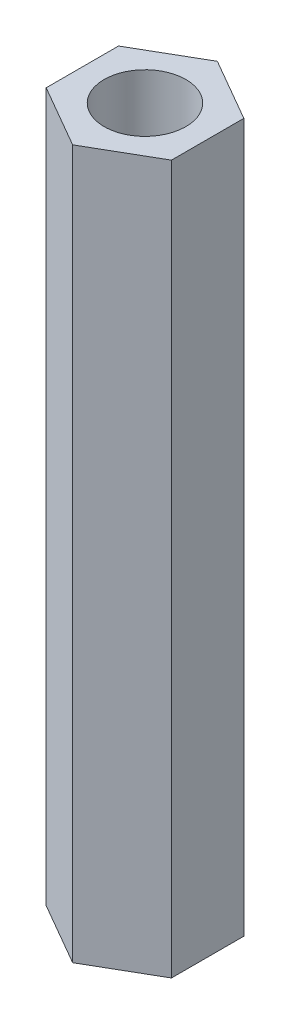
ISO-10303-21;
HEADER;
FILE_DESCRIPTION(('STEP AP214'),'2;1');
FILE_NAME('part.step','',(''),(''),'','','');
FILE_SCHEMA(('AUTOMOTIVE_DESIGN { 1 0 10303 214 1 1 1 1 }'));
ENDSEC;
DATA;
#1=APPLICATION_CONTEXT('core data for automotive mechanical design processes');
#2=APPLICATION_PROTOCOL_DEFINITION('international standard','automotive_design',2000,#1);
#3=PRODUCT_CONTEXT('',#1,'mechanical');
#4=PRODUCT('Part','Part','',(#3));
#5=PRODUCT_RELATED_PRODUCT_CATEGORY('part','',(#4));
#6=PRODUCT_DEFINITION_FORMATION('','',#4);
#7=PRODUCT_DEFINITION_CONTEXT('part definition',#1,'design');
#8=PRODUCT_DEFINITION('design','',#6,#7);
#9=PRODUCT_DEFINITION_SHAPE('','',#8);
#10=(LENGTH_UNIT() NAMED_UNIT(*) SI_UNIT(.MILLI.,.METRE.));
#11=(NAMED_UNIT(*) PLANE_ANGLE_UNIT() SI_UNIT($,.RADIAN.));
#12=(NAMED_UNIT(*) SI_UNIT($,.STERADIAN.) SOLID_ANGLE_UNIT());
#13=UNCERTAINTY_MEASURE_WITH_UNIT(LENGTH_MEASURE(1.E-05),#10,'distance_accuracy_value','');
#14=(GEOMETRIC_REPRESENTATION_CONTEXT(3) GLOBAL_UNCERTAINTY_ASSIGNED_CONTEXT((#13)) GLOBAL_UNIT_ASSIGNED_CONTEXT((#10,
#11,#12)) REPRESENTATION_CONTEXT('',''));
#15=CARTESIAN_POINT('',(0.,0.,0.));
#16=DIRECTION('',(0.,0.,1.));
#17=DIRECTION('',(1.,0.,0.));
#18=AXIS2_PLACEMENT_3D('',#15,#16,#17);
#19=CARTESIAN_POINT('',(0.,26.,0.));
#20=DIRECTION('',(0.,1.,0.));
#21=DIRECTION('',(0.,0.,1.));
#22=AXIS2_PLACEMENT_3D('',#19,#20,#21);
#23=PLANE('',#22);
#24=DIRECTION('',(-0.866025403784442,0.,-0.499999999999995));
#25=VECTOR('',#24,1.);
#26=CARTESIAN_POINT('',(2.29999999999999,26.,-1.32790561913617));
#27=LINE('',#26,#25);
#28=CARTESIAN_POINT('',(2.29999999999999,26.,-1.32790561913617));
#29=VERTEX_POINT('',#28);
#30=CARTESIAN_POINT('',(0.,26.,-2.65581123827228));
#31=VERTEX_POINT('',#30);
#32=EDGE_CURVE('E134',#29,#31,#27,.T.);
#33=ORIENTED_EDGE('',*,*,#32,.T.);
#34=DIRECTION('',(-0.866025403784438,0.,0.500000000000001));
#35=VECTOR('',#34,1.);
#36=CARTESIAN_POINT('',(0.,26.,-2.65581123827228));
#37=LINE('',#36,#35);
#38=CARTESIAN_POINT('',(-2.3,26.,-1.32790561913613));
#39=VERTEX_POINT('',#38);
#40=EDGE_CURVE('E92',#31,#39,#37,.T.);
#41=ORIENTED_EDGE('',*,*,#40,.T.);
#42=DIRECTION('',(0.,0.,1.));
#43=VECTOR('',#42,1.);
#44=CARTESIAN_POINT('',(-2.3,26.,-1.32790561913613));
#45=LINE('',#44,#43);
#46=CARTESIAN_POINT('',(-2.3,26.,1.32790561913615));
#47=VERTEX_POINT('',#46);
#48=EDGE_CURVE('E105',#39,#47,#45,.T.);
#49=ORIENTED_EDGE('',*,*,#48,.T.);
#50=DIRECTION('',(0.866025403784442,0.,0.499999999999995));
#51=VECTOR('',#50,1.);
#52=CARTESIAN_POINT('',(-2.3,26.,1.32790561913615));
#53=LINE('',#52,#51);
#54=CARTESIAN_POINT('',(0.,26.,2.65581123827228));
#55=VERTEX_POINT('',#54);
#56=EDGE_CURVE('E99',#47,#55,#53,.T.);
#57=ORIENTED_EDGE('',*,*,#56,.T.);
#58=DIRECTION('',(0.866025403784435,0.,-0.500000000000007));
#59=VECTOR('',#58,1.);
#60=CARTESIAN_POINT('',(0.,26.,2.65581123827228));
#61=LINE('',#60,#59);
#62=CARTESIAN_POINT('',(2.30000000000001,26.,1.32790561913612));
#63=VERTEX_POINT('',#62);
#64=EDGE_CURVE('E103',#55,#63,#61,.T.);
#65=ORIENTED_EDGE('',*,*,#64,.T.);
#66=DIRECTION('',(0.,0.,-1.));
#67=VECTOR('',#66,1.);
#68=CARTESIAN_POINT('',(2.30000000000001,26.,1.32790561913612));
#69=LINE('',#68,#67);
#70=EDGE_CURVE('E55',#63,#29,#69,.T.);
#71=ORIENTED_EDGE('',*,*,#70,.T.);
#72=EDGE_LOOP('',(#33,#41,#49,#57,#65,#71));
#73=FACE_BOUND('',#72,.T.);
#74=CARTESIAN_POINT('',(0.,26.,0.));
#75=DIRECTION('',(0.,1.,0.));
#76=DIRECTION('',(0.,0.,1.));
#77=AXIS2_PLACEMENT_3D('',#74,#75,#76);
#78=CIRCLE('',#77,1.5);
#79=CARTESIAN_POINT('',(0.,26.,-1.5));
#80=VERTEX_POINT('',#79);
#81=EDGE_CURVE('E127',#80,#80,#78,.T.);
#82=ORIENTED_EDGE('',*,*,#81,.F.);
#83=EDGE_LOOP('',(#82));
#84=FACE_BOUND('',#83,.T.);
#85=ADVANCED_FACE('F38',(#73,#84),#23,.T.);
#86=CARTESIAN_POINT('',(0.,0.,0.));
#87=DIRECTION('',(0.,1.,0.));
#88=DIRECTION('',(0.,0.,1.));
#89=AXIS2_PLACEMENT_3D('',#86,#87,#88);
#90=PLANE('',#89);
#91=DIRECTION('',(-0.866025403784442,0.,-0.499999999999995));
#92=VECTOR('',#91,1.);
#93=CARTESIAN_POINT('',(2.29999999999999,0.,-1.32790561913617));
#94=LINE('',#93,#92);
#95=CARTESIAN_POINT('',(2.29999999999999,0.,-1.32790561913617));
#96=VERTEX_POINT('',#95);
#97=CARTESIAN_POINT('',(0.,0.,-2.65581123827228));
#98=VERTEX_POINT('',#97);
#99=EDGE_CURVE('E123',#96,#98,#94,.T.);
#100=ORIENTED_EDGE('',*,*,#99,.F.);
#101=DIRECTION('',(0.,0.,-1.));
#102=VECTOR('',#101,1.);
#103=CARTESIAN_POINT('',(2.30000000000001,0.,1.32790561913612));
#104=LINE('',#103,#102);
#105=CARTESIAN_POINT('',(2.30000000000001,0.,1.32790561913612));
#106=VERTEX_POINT('',#105);
#107=EDGE_CURVE('E84',#106,#96,#104,.T.);
#108=ORIENTED_EDGE('',*,*,#107,.F.);
#109=DIRECTION('',(0.866025403784435,0.,-0.500000000000007));
#110=VECTOR('',#109,1.);
#111=CARTESIAN_POINT('',(0.,0.,2.65581123827228));
#112=LINE('',#111,#110);
#113=CARTESIAN_POINT('',(0.,0.,2.65581123827228));
#114=VERTEX_POINT('',#113);
#115=EDGE_CURVE('E78',#114,#106,#112,.T.);
#116=ORIENTED_EDGE('',*,*,#115,.F.);
#117=DIRECTION('',(0.866025403784442,0.,0.499999999999995));
#118=VECTOR('',#117,1.);
#119=CARTESIAN_POINT('',(-2.3,0.,1.32790561913615));
#120=LINE('',#119,#118);
#121=CARTESIAN_POINT('',(-2.3,0.,1.32790561913615));
#122=VERTEX_POINT('',#121);
#123=EDGE_CURVE('E113',#122,#114,#120,.T.);
#124=ORIENTED_EDGE('',*,*,#123,.F.);
#125=DIRECTION('',(0.,0.,1.));
#126=VECTOR('',#125,1.);
#127=CARTESIAN_POINT('',(-2.3,0.,-1.32790561913613));
#128=LINE('',#127,#126);
#129=CARTESIAN_POINT('',(-2.3,0.,-1.32790561913613));
#130=VERTEX_POINT('',#129);
#131=EDGE_CURVE('E129',#130,#122,#128,.T.);
#132=ORIENTED_EDGE('',*,*,#131,.F.);
#133=DIRECTION('',(-0.866025403784438,0.,0.500000000000001));
#134=VECTOR('',#133,1.);
#135=CARTESIAN_POINT('',(0.,0.,-2.65581123827228));
#136=LINE('',#135,#134);
#137=EDGE_CURVE('E126',#98,#130,#136,.T.);
#138=ORIENTED_EDGE('',*,*,#137,.F.);
#139=EDGE_LOOP('',(#100,#108,#116,#124,#132,#138));
#140=FACE_BOUND('',#139,.T.);
#141=CARTESIAN_POINT('',(0.,0.,0.));
#142=DIRECTION('',(0.,1.,0.));
#143=DIRECTION('',(0.,0.,1.));
#144=AXIS2_PLACEMENT_3D('',#141,#142,#143);
#145=CIRCLE('',#144,1.5);
#146=CARTESIAN_POINT('',(0.,0.,-1.5));
#147=VERTEX_POINT('',#146);
#148=EDGE_CURVE('E245',#147,#147,#145,.T.);
#149=ORIENTED_EDGE('',*,*,#148,.T.);
#150=EDGE_LOOP('',(#149));
#151=FACE_BOUND('',#150,.T.);
#152=ADVANCED_FACE('F143',(#140,#151),#90,.F.);
#153=CARTESIAN_POINT('',(2.29999999999999,26.,-1.32790561913617));
#154=DIRECTION('',(-0.499999999999995,0.,0.866025403784442));
#155=DIRECTION('',(0.866025403784442,0.,0.499999999999995));
#156=AXIS2_PLACEMENT_3D('',#153,#154,#155);
#157=PLANE('',#156);
#158=ORIENTED_EDGE('',*,*,#99,.T.);
#159=DIRECTION('',(0.,-1.,0.));
#160=VECTOR('',#159,1.);
#161=CARTESIAN_POINT('',(0.,26.,-2.65581123827228));
#162=LINE('',#161,#160);
#163=EDGE_CURVE('E11',#31,#98,#162,.T.);
#164=ORIENTED_EDGE('',*,*,#163,.F.);
#165=ORIENTED_EDGE('',*,*,#32,.F.);
#166=DIRECTION('',(0.,-1.,0.));
#167=VECTOR('',#166,1.);
#168=CARTESIAN_POINT('',(2.29999999999999,26.,-1.32790561913617));
#169=LINE('',#168,#167);
#170=EDGE_CURVE('E119',#29,#96,#169,.T.);
#171=ORIENTED_EDGE('',*,*,#170,.T.);
#172=EDGE_LOOP('',(#158,#164,#165,#171));
#173=FACE_BOUND('',#172,.T.);
#174=ADVANCED_FACE('F40',(#173),#157,.F.);
#175=CARTESIAN_POINT('',(0.,26.,-2.65581123827228));
#176=DIRECTION('',(0.500000000000001,0.,0.866025403784438));
#177=DIRECTION('',(0.866025403784438,0.,-0.500000000000001));
#178=AXIS2_PLACEMENT_3D('',#175,#176,#177);
#179=PLANE('',#178);
#180=ORIENTED_EDGE('',*,*,#137,.T.);
#181=DIRECTION('',(0.,-1.,0.));
#182=VECTOR('',#181,1.);
#183=CARTESIAN_POINT('',(-2.3,26.,-1.32790561913613));
#184=LINE('',#183,#182);
#185=EDGE_CURVE('E47',#39,#130,#184,.T.);
#186=ORIENTED_EDGE('',*,*,#185,.F.);
#187=ORIENTED_EDGE('',*,*,#40,.F.);
#188=ORIENTED_EDGE('',*,*,#163,.T.);
#189=EDGE_LOOP('',(#180,#186,#187,#188));
#190=FACE_BOUND('',#189,.T.);
#191=ADVANCED_FACE('F168',(#190),#179,.F.);
#192=CARTESIAN_POINT('',(-2.3,26.,-1.32790561913613));
#193=DIRECTION('',(1.,0.,0.));
#194=DIRECTION('',(0.,0.,-1.));
#195=AXIS2_PLACEMENT_3D('',#192,#193,#194);
#196=PLANE('',#195);
#197=ORIENTED_EDGE('',*,*,#131,.T.);
#198=DIRECTION('',(0.,-1.,0.));
#199=VECTOR('',#198,1.);
#200=CARTESIAN_POINT('',(-2.3,26.,1.32790561913615));
#201=LINE('',#200,#199);
#202=EDGE_CURVE('E114',#47,#122,#201,.T.);
#203=ORIENTED_EDGE('',*,*,#202,.F.);
#204=ORIENTED_EDGE('',*,*,#48,.F.);
#205=ORIENTED_EDGE('',*,*,#185,.T.);
#206=EDGE_LOOP('',(#197,#203,#204,#205));
#207=FACE_BOUND('',#206,.T.);
#208=ADVANCED_FACE('F140',(#207),#196,.F.);
#209=CARTESIAN_POINT('',(-2.3,26.,1.32790561913615));
#210=DIRECTION('',(0.499999999999995,0.,-0.866025403784442));
#211=DIRECTION('',(-0.866025403784442,0.,-0.499999999999995));
#212=AXIS2_PLACEMENT_3D('',#209,#210,#211);
#213=PLANE('',#212);
#214=ORIENTED_EDGE('',*,*,#123,.T.);
#215=DIRECTION('',(0.,-1.,0.));
#216=VECTOR('',#215,1.);
#217=CARTESIAN_POINT('',(0.,26.,2.65581123827228));
#218=LINE('',#217,#216);
#219=EDGE_CURVE('E110',#55,#114,#218,.T.);
#220=ORIENTED_EDGE('',*,*,#219,.F.);
#221=ORIENTED_EDGE('',*,*,#56,.F.);
#222=ORIENTED_EDGE('',*,*,#202,.T.);
#223=EDGE_LOOP('',(#214,#220,#221,#222));
#224=FACE_BOUND('',#223,.T.);
#225=ADVANCED_FACE('F111',(#224),#213,.F.);
#226=CARTESIAN_POINT('',(0.,26.,2.65581123827228));
#227=DIRECTION('',(-0.500000000000007,0.,-0.866025403784434));
#228=DIRECTION('',(-0.866025403784435,0.,0.500000000000007));
#229=AXIS2_PLACEMENT_3D('',#226,#227,#228);
#230=PLANE('',#229);
#231=ORIENTED_EDGE('',*,*,#115,.T.);
#232=DIRECTION('',(0.,-1.,0.));
#233=VECTOR('',#232,1.);
#234=CARTESIAN_POINT('',(2.30000000000001,26.,1.32790561913612));
#235=LINE('',#234,#233);
#236=EDGE_CURVE('E115',#63,#106,#235,.T.);
#237=ORIENTED_EDGE('',*,*,#236,.F.);
#238=ORIENTED_EDGE('',*,*,#64,.F.);
#239=ORIENTED_EDGE('',*,*,#219,.T.);
#240=EDGE_LOOP('',(#231,#237,#238,#239));
#241=FACE_BOUND('',#240,.T.);
#242=ADVANCED_FACE('F117',(#241),#230,.F.);
#243=CARTESIAN_POINT('',(2.30000000000001,26.,1.32790561913612));
#244=DIRECTION('',(-1.,0.,0.));
#245=DIRECTION('',(0.,0.,1.));
#246=AXIS2_PLACEMENT_3D('',#243,#244,#245);
#247=PLANE('',#246);
#248=ORIENTED_EDGE('',*,*,#107,.T.);
#249=ORIENTED_EDGE('',*,*,#170,.F.);
#250=ORIENTED_EDGE('',*,*,#70,.F.);
#251=ORIENTED_EDGE('',*,*,#236,.T.);
#252=EDGE_LOOP('',(#248,#249,#250,#251));
#253=FACE_BOUND('',#252,.T.);
#254=ADVANCED_FACE('F148',(#253),#247,.F.);
#255=CARTESIAN_POINT('',(0.,26.,0.));
#256=DIRECTION('',(0.,-1.,0.));
#257=DIRECTION('',(0.,0.,-1.));
#258=AXIS2_PLACEMENT_3D('',#255,#256,#257);
#259=CYLINDRICAL_SURFACE('',#258,1.5);
#260=CARTESIAN_POINT('',(0.,26.,-1.5));
#261=CARTESIAN_POINT('',(0.,25.7291666666667,-1.5));
#262=CARTESIAN_POINT('',(0.,25.4583333333333,-1.5));
#263=CARTESIAN_POINT('',(0.,24.9166666666667,-1.5));
#264=CARTESIAN_POINT('',(0.,24.6458333333333,-1.5));
#265=CARTESIAN_POINT('',(0.,24.1041666666667,-1.5));
#266=CARTESIAN_POINT('',(0.,23.8333333333333,-1.5));
#267=CARTESIAN_POINT('',(0.,23.2916666666667,-1.5));
#268=CARTESIAN_POINT('',(0.,23.0208333333333,-1.5));
#269=CARTESIAN_POINT('',(0.,22.4791666666667,-1.5));
#270=CARTESIAN_POINT('',(0.,22.2083333333333,-1.5));
#271=CARTESIAN_POINT('',(0.,21.6666666666667,-1.5));
#272=CARTESIAN_POINT('',(0.,21.3958333333333,-1.5));
#273=CARTESIAN_POINT('',(0.,20.8541666666667,-1.5));
#274=CARTESIAN_POINT('',(0.,20.5833333333333,-1.5));
#275=CARTESIAN_POINT('',(0.,20.0416666666667,-1.5));
#276=CARTESIAN_POINT('',(0.,19.7708333333333,-1.5));
#277=CARTESIAN_POINT('',(0.,19.2291666666667,-1.5));
#278=CARTESIAN_POINT('',(0.,18.9583333333333,-1.5));
#279=CARTESIAN_POINT('',(0.,18.4166666666667,-1.5));
#280=CARTESIAN_POINT('',(0.,18.1458333333333,-1.5));
#281=CARTESIAN_POINT('',(0.,17.6041666666667,-1.5));
#282=CARTESIAN_POINT('',(0.,17.3333333333333,-1.5));
#283=CARTESIAN_POINT('',(0.,16.7916666666667,-1.5));
#284=CARTESIAN_POINT('',(0.,16.5208333333333,-1.5));
#285=CARTESIAN_POINT('',(0.,15.9791666666667,-1.5));
#286=CARTESIAN_POINT('',(0.,15.7083333333333,-1.5));
#287=CARTESIAN_POINT('',(0.,15.1666666666667,-1.5));
#288=CARTESIAN_POINT('',(0.,14.8958333333333,-1.5));
#289=CARTESIAN_POINT('',(0.,14.3541666666667,-1.5));
#290=CARTESIAN_POINT('',(0.,14.0833333333333,-1.5));
#291=CARTESIAN_POINT('',(0.,13.5416666666667,-1.5));
#292=CARTESIAN_POINT('',(0.,13.2708333333333,-1.5));
#293=CARTESIAN_POINT('',(0.,12.7291666666667,-1.5));
#294=CARTESIAN_POINT('',(0.,12.4583333333333,-1.5));
#295=CARTESIAN_POINT('',(0.,11.9166666666667,-1.5));
#296=CARTESIAN_POINT('',(0.,11.6458333333333,-1.5));
#297=CARTESIAN_POINT('',(0.,11.1041666666667,-1.5));
#298=CARTESIAN_POINT('',(0.,10.8333333333333,-1.5));
#299=CARTESIAN_POINT('',(0.,10.2916666666667,-1.5));
#300=CARTESIAN_POINT('',(0.,10.0208333333333,-1.5));
#301=CARTESIAN_POINT('',(0.,9.47916666666667,-1.5));
#302=CARTESIAN_POINT('',(0.,9.20833333333333,-1.5));
#303=CARTESIAN_POINT('',(0.,8.66666666666667,-1.5));
#304=CARTESIAN_POINT('',(0.,8.39583333333333,-1.5));
#305=CARTESIAN_POINT('',(0.,7.85416666666667,-1.5));
#306=CARTESIAN_POINT('',(0.,7.58333333333333,-1.5));
#307=CARTESIAN_POINT('',(0.,7.04166666666667,-1.5));
#308=CARTESIAN_POINT('',(0.,6.77083333333333,-1.5));
#309=CARTESIAN_POINT('',(0.,6.22916666666667,-1.5));
#310=CARTESIAN_POINT('',(0.,5.95833333333333,-1.5));
#311=CARTESIAN_POINT('',(0.,5.41666666666667,-1.5));
#312=CARTESIAN_POINT('',(0.,5.14583333333333,-1.5));
#313=CARTESIAN_POINT('',(0.,4.60416666666667,-1.5));
#314=CARTESIAN_POINT('',(0.,4.33333333333333,-1.5));
#315=CARTESIAN_POINT('',(0.,3.79166666666667,-1.5));
#316=CARTESIAN_POINT('',(0.,3.52083333333333,-1.5));
#317=CARTESIAN_POINT('',(0.,2.97916666666667,-1.5));
#318=CARTESIAN_POINT('',(0.,2.70833333333333,-1.5));
#319=CARTESIAN_POINT('',(0.,2.16666666666667,-1.5));
#320=CARTESIAN_POINT('',(0.,1.89583333333333,-1.5));
#321=CARTESIAN_POINT('',(0.,1.35416666666667,-1.5));
#322=CARTESIAN_POINT('',(0.,1.08333333333333,-1.5));
#323=CARTESIAN_POINT('',(0.,0.541666666666667,-1.5));
#324=CARTESIAN_POINT('',(0.,0.270833333333334,-1.5));
#325=CARTESIAN_POINT('',(0.,0.,-1.5));
#326=B_SPLINE_CURVE_WITH_KNOTS('',3,(#260,#261,#262,#263,#264,#265,#266,#267,#268,#269,#270,
#271,#272,#273,#274,#275,#276,#277,#278,#279,#280,#281,#282,#283,#284,#285,#286,#287,#288,#289,
#290,#291,#292,#293,#294,#295,#296,#297,#298,#299,#300,#301,#302,#303,#304,#305,#306,#307,#308,
#309,#310,#311,#312,#313,#314,#315,#316,#317,#318,#319,#320,#321,#322,#323,#324,#325),
.UNSPECIFIED.,.F.,.F.,(4,2,2,2,2,2,2,2,2,2,2,2,2,2,2,2,2,2,2,2,2,2,2,2,2,2,2,2,2,2,2,2,4),(0.,
0.812500000000001,1.625,2.4375,3.25,4.0625,4.875,5.6875,6.5,7.3125,8.125,8.9375,9.75,10.5625,
11.375,12.1875,13.,13.8125,14.625,15.4375,16.25,17.0625,17.875,18.6875,19.5,20.3125,21.125,
21.9375,22.75,23.5625,24.375,25.1875,26.),.UNSPECIFIED.);
#327=EDGE_CURVE('BSEAM150',#80,#147,#326,.T.);
#328=ORIENTED_EDGE('',*,*,#81,.T.);
#329=ORIENTED_EDGE('',*,*,#148,.F.);
#330=ORIENTED_EDGE('',*,*,#327,.T.);
#331=ORIENTED_EDGE('',*,*,#327,.F.);
#332=EDGE_LOOP('',(#328,#330,#329,#331));
#333=FACE_BOUND('',#332,.T.);
#334=ADVANCED_FACE('F150',(#333),#259,.F.);
#335=CLOSED_SHELL('',(#85,#152,#174,#191,#208,#225,#242,#254,#334));
#336=MANIFOLD_SOLID_BREP('B2',#335);
#337=ADVANCED_BREP_SHAPE_REPRESENTATION('',(#18,#336),#14);
#338=SHAPE_DEFINITION_REPRESENTATION(#9,#337);
ENDSEC;
END-ISO-10303-21;
